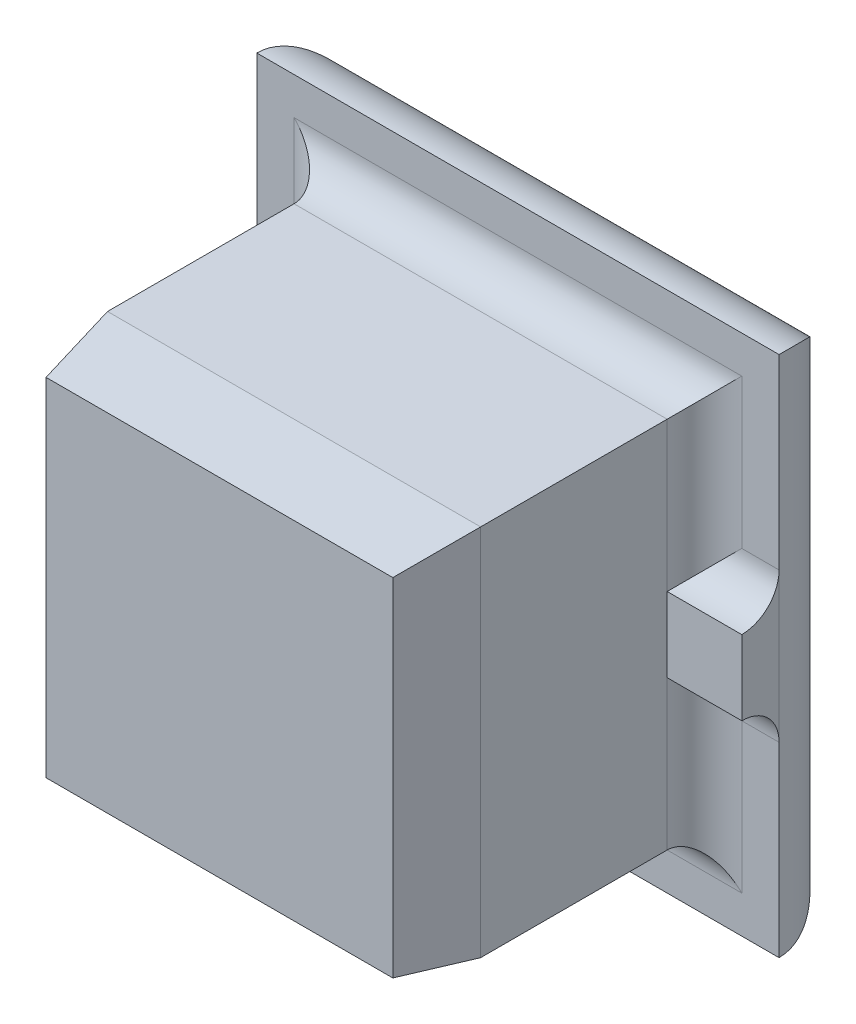
ISO-10303-21;
HEADER;
FILE_DESCRIPTION(('STEP AP214'),'2;1');
FILE_NAME('part.step','',(''),(''),'','','');
FILE_SCHEMA(('AUTOMOTIVE_DESIGN { 1 0 10303 214 1 1 1 1 }'));
ENDSEC;
DATA;
#1=APPLICATION_CONTEXT('core data for automotive mechanical design processes');
#2=APPLICATION_PROTOCOL_DEFINITION('international standard','automotive_design',2000,#1);
#3=PRODUCT_CONTEXT('',#1,'mechanical');
#4=PRODUCT('Part','Part','',(#3));
#5=PRODUCT_RELATED_PRODUCT_CATEGORY('part','',(#4));
#6=PRODUCT_DEFINITION_FORMATION('','',#4);
#7=PRODUCT_DEFINITION_CONTEXT('part definition',#1,'design');
#8=PRODUCT_DEFINITION('design','',#6,#7);
#9=PRODUCT_DEFINITION_SHAPE('','',#8);
#10=(LENGTH_UNIT() NAMED_UNIT(*) SI_UNIT(.MILLI.,.METRE.));
#11=(NAMED_UNIT(*) PLANE_ANGLE_UNIT() SI_UNIT($,.RADIAN.));
#12=(NAMED_UNIT(*) SI_UNIT($,.STERADIAN.) SOLID_ANGLE_UNIT());
#13=UNCERTAINTY_MEASURE_WITH_UNIT(LENGTH_MEASURE(1.E-05),#10,'distance_accuracy_value','');
#14=(GEOMETRIC_REPRESENTATION_CONTEXT(3) GLOBAL_UNCERTAINTY_ASSIGNED_CONTEXT((#13)) GLOBAL_UNIT_ASSIGNED_CONTEXT((#10,
#11,#12)) REPRESENTATION_CONTEXT('',''));
#15=CARTESIAN_POINT('',(0.,0.,0.));
#16=DIRECTION('',(0.,0.,1.));
#17=DIRECTION('',(1.,0.,0.));
#18=AXIS2_PLACEMENT_3D('',#15,#16,#17);
#19=CARTESIAN_POINT('',(0.,0.,0.));
#20=DIRECTION('',(0.,0.,-1.));
#21=DIRECTION('',(-1.,0.,0.));
#22=AXIS2_PLACEMENT_3D('',#19,#20,#21);
#23=PLANE('',#22);
#24=DIRECTION('',(0.,1.,0.));
#25=VECTOR('',#24,1.);
#26=CARTESIAN_POINT('',(6.,1.,0.));
#27=LINE('',#26,#25);
#28=CARTESIAN_POINT('',(6.,6.,0.));
#29=VERTEX_POINT('',#28);
#30=CARTESIAN_POINT('',(6.,2.,0.));
#31=VERTEX_POINT('',#30);
#32=EDGE_CURVE('E84',#29,#31,#27,.F.);
#33=ORIENTED_EDGE('',*,*,#32,.T.);
#34=DIRECTION('',(-1.,0.,0.));
#35=VECTOR('',#34,1.);
#36=CARTESIAN_POINT('',(7.,2.,0.));
#37=LINE('',#36,#35);
#38=CARTESIAN_POINT('',(7.,2.,0.));
#39=VERTEX_POINT('',#38);
#40=EDGE_CURVE('E239',#31,#39,#37,.F.);
#41=ORIENTED_EDGE('',*,*,#40,.T.);
#42=DIRECTION('',(0.,-1.,0.));
#43=VECTOR('',#42,1.);
#44=CARTESIAN_POINT('',(7.,-7.,0.));
#45=LINE('',#44,#43);
#46=CARTESIAN_POINT('',(7.,7.,0.));
#47=VERTEX_POINT('',#46);
#48=EDGE_CURVE('E271',#47,#39,#45,.T.);
#49=ORIENTED_EDGE('',*,*,#48,.F.);
#50=DIRECTION('',(1.,0.,0.));
#51=VECTOR('',#50,1.);
#52=CARTESIAN_POINT('',(-7.,7.,0.));
#53=LINE('',#52,#51);
#54=CARTESIAN_POINT('',(-7.,7.,0.));
#55=VERTEX_POINT('',#54);
#56=EDGE_CURVE('E259',#55,#47,#53,.T.);
#57=ORIENTED_EDGE('',*,*,#56,.F.);
#58=DIRECTION('',(0.,1.,0.));
#59=VECTOR('',#58,1.);
#60=CARTESIAN_POINT('',(-7.,-7.,0.));
#61=LINE('',#60,#59);
#62=CARTESIAN_POINT('',(-7.,2.,0.));
#63=VERTEX_POINT('',#62);
#64=EDGE_CURVE('E260',#63,#55,#61,.T.);
#65=ORIENTED_EDGE('',*,*,#64,.F.);
#66=DIRECTION('',(-1.,0.,0.));
#67=VECTOR('',#66,1.);
#68=CARTESIAN_POINT('',(-5.,2.,0.));
#69=LINE('',#68,#67);
#70=CARTESIAN_POINT('',(-6.,2.,0.));
#71=VERTEX_POINT('',#70);
#72=EDGE_CURVE('E232',#63,#71,#69,.F.);
#73=ORIENTED_EDGE('',*,*,#72,.T.);
#74=DIRECTION('',(0.,-1.,0.));
#75=VECTOR('',#74,1.);
#76=CARTESIAN_POINT('',(-6.,5.,0.));
#77=LINE('',#76,#75);
#78=CARTESIAN_POINT('',(-6.,6.,0.));
#79=VERTEX_POINT('',#78);
#80=EDGE_CURVE('E227',#71,#79,#77,.F.);
#81=ORIENTED_EDGE('',*,*,#80,.T.);
#82=DIRECTION('',(-1.,0.,0.));
#83=VECTOR('',#82,1.);
#84=CARTESIAN_POINT('',(5.,6.,0.));
#85=LINE('',#84,#83);
#86=EDGE_CURVE('E230',#79,#29,#85,.F.);
#87=ORIENTED_EDGE('',*,*,#86,.T.);
#88=EDGE_LOOP('',(#33,#41,#49,#57,#65,#73,#81,#87));
#89=FACE_BOUND('',#88,.T.);
#90=ADVANCED_FACE('F35',(#89),#23,.F.);
#91=CARTESIAN_POINT('',(7.,-2.,0.));
#92=VERTEX_POINT('',#91);
#93=CARTESIAN_POINT('',(7.,-7.,0.));
#94=VERTEX_POINT('',#93);
#95=EDGE_CURVE('E274',#92,#94,#45,.T.);
#96=ORIENTED_EDGE('',*,*,#95,.F.);
#97=DIRECTION('',(1.,0.,0.));
#98=VECTOR('',#97,1.);
#99=CARTESIAN_POINT('',(5.,-2.,0.));
#100=LINE('',#99,#98);
#101=CARTESIAN_POINT('',(6.,-2.,0.));
#102=VERTEX_POINT('',#101);
#103=EDGE_CURVE('E191',#92,#102,#100,.F.);
#104=ORIENTED_EDGE('',*,*,#103,.T.);
#105=DIRECTION('',(0.,1.,0.));
#106=VECTOR('',#105,1.);
#107=CARTESIAN_POINT('',(6.,-5.,0.));
#108=LINE('',#107,#106);
#109=CARTESIAN_POINT('',(6.,-6.,0.));
#110=VERTEX_POINT('',#109);
#111=EDGE_CURVE('E183',#102,#110,#108,.F.);
#112=ORIENTED_EDGE('',*,*,#111,.T.);
#113=DIRECTION('',(1.,0.,0.));
#114=VECTOR('',#113,1.);
#115=CARTESIAN_POINT('',(-5.,-6.,0.));
#116=LINE('',#115,#114);
#117=CARTESIAN_POINT('',(-6.,-6.,0.));
#118=VERTEX_POINT('',#117);
#119=EDGE_CURVE('E241',#110,#118,#116,.F.);
#120=ORIENTED_EDGE('',*,*,#119,.T.);
#121=DIRECTION('',(0.,-1.,0.));
#122=VECTOR('',#121,1.);
#123=CARTESIAN_POINT('',(-6.,-0.999999999999999,0.));
#124=LINE('',#123,#122);
#125=CARTESIAN_POINT('',(-6.,-2.,0.));
#126=VERTEX_POINT('',#125);
#127=EDGE_CURVE('E144',#118,#126,#124,.F.);
#128=ORIENTED_EDGE('',*,*,#127,.T.);
#129=DIRECTION('',(1.,0.,0.));
#130=VECTOR('',#129,1.);
#131=CARTESIAN_POINT('',(-7.,-2.,0.));
#132=LINE('',#131,#130);
#133=CARTESIAN_POINT('',(-7.,-2.,0.));
#134=VERTEX_POINT('',#133);
#135=EDGE_CURVE('E194',#126,#134,#132,.F.);
#136=ORIENTED_EDGE('',*,*,#135,.T.);
#137=CARTESIAN_POINT('',(-7.,-7.,0.));
#138=VERTEX_POINT('',#137);
#139=EDGE_CURVE('E250',#138,#134,#61,.T.);
#140=ORIENTED_EDGE('',*,*,#139,.F.);
#141=DIRECTION('',(-1.,0.,0.));
#142=VECTOR('',#141,1.);
#143=CARTESIAN_POINT('',(-7.,-7.,0.));
#144=LINE('',#143,#142);
#145=EDGE_CURVE('E273',#94,#138,#144,.T.);
#146=ORIENTED_EDGE('',*,*,#145,.F.);
#147=EDGE_LOOP('',(#96,#104,#112,#120,#128,#136,#140,#146));
#148=FACE_BOUND('',#147,.T.);
#149=ADVANCED_FACE('F247',(#148),#23,.F.);
#150=CARTESIAN_POINT('',(5.,-5.,8.));
#151=DIRECTION('',(-1.,0.,0.));
#152=DIRECTION('',(0.,0.,1.));
#153=AXIS2_PLACEMENT_3D('',#150,#151,#152);
#154=PLANE('',#153);
#155=DIRECTION('',(0.,-1.,0.));
#156=VECTOR('',#155,1.);
#157=CARTESIAN_POINT('',(5.,1.,1.));
#158=LINE('',#157,#156);
#159=CARTESIAN_POINT('',(5.,1.,1.));
#160=VERTEX_POINT('',#159);
#161=CARTESIAN_POINT('',(5.,-0.999999999999999,1.));
#162=VERTEX_POINT('',#161);
#163=EDGE_CURVE('E424',#160,#162,#158,.T.);
#164=ORIENTED_EDGE('',*,*,#163,.F.);
#165=DIRECTION('',(0.,1.,0.));
#166=VECTOR('',#165,1.);
#167=CARTESIAN_POINT('',(5.,5.,1.));
#168=LINE('',#167,#166);
#169=CARTESIAN_POINT('',(5.,5.,1.));
#170=VERTEX_POINT('',#169);
#171=EDGE_CURVE('E126',#160,#170,#168,.T.);
#172=ORIENTED_EDGE('',*,*,#171,.T.);
#173=DIRECTION('',(0.,0.,-1.));
#174=VECTOR('',#173,1.);
#175=CARTESIAN_POINT('',(5.,5.,8.));
#176=LINE('',#175,#174);
#177=CARTESIAN_POINT('',(5.,5.,5.99999999999996));
#178=VERTEX_POINT('',#177);
#179=EDGE_CURVE('E279',#178,#170,#176,.T.);
#180=ORIENTED_EDGE('',*,*,#179,.F.);
#181=DIRECTION('',(0.,-1.,0.));
#182=VECTOR('',#181,1.);
#183=CARTESIAN_POINT('',(5.,-5.,5.99999999999996));
#184=LINE('',#183,#182);
#185=CARTESIAN_POINT('',(5.,-5.,5.99999999999996));
#186=VERTEX_POINT('',#185);
#187=EDGE_CURVE('E318',#178,#186,#184,.T.);
#188=ORIENTED_EDGE('',*,*,#187,.T.);
#189=DIRECTION('',(0.,0.,-1.));
#190=VECTOR('',#189,1.);
#191=CARTESIAN_POINT('',(5.,-5.,8.));
#192=LINE('',#191,#190);
#193=CARTESIAN_POINT('',(5.,-5.,1.));
#194=VERTEX_POINT('',#193);
#195=EDGE_CURVE('E138',#186,#194,#192,.T.);
#196=ORIENTED_EDGE('',*,*,#195,.T.);
#197=DIRECTION('',(0.,1.,0.));
#198=VECTOR('',#197,1.);
#199=CARTESIAN_POINT('',(5.,-0.999999999999999,1.));
#200=LINE('',#199,#198);
#201=EDGE_CURVE('E185',#194,#162,#200,.T.);
#202=ORIENTED_EDGE('',*,*,#201,.T.);
#203=EDGE_LOOP('',(#164,#172,#180,#188,#196,#202));
#204=FACE_BOUND('',#203,.T.);
#205=ADVANCED_FACE('F431',(#204),#154,.F.);
#206=CARTESIAN_POINT('',(-5.,-5.,8.));
#207=DIRECTION('',(1.,0.,0.));
#208=DIRECTION('',(0.,0.,-1.));
#209=AXIS2_PLACEMENT_3D('',#206,#207,#208);
#210=PLANE('',#209);
#211=DIRECTION('',(0.,0.,-1.));
#212=VECTOR('',#211,1.);
#213=CARTESIAN_POINT('',(-5.,5.,8.));
#214=LINE('',#213,#212);
#215=CARTESIAN_POINT('',(-5.,5.,5.99999999999996));
#216=VERTEX_POINT('',#215);
#217=CARTESIAN_POINT('',(-5.,5.,1.));
#218=VERTEX_POINT('',#217);
#219=EDGE_CURVE('E200',#216,#218,#214,.T.);
#220=ORIENTED_EDGE('',*,*,#219,.T.);
#221=DIRECTION('',(0.,-1.,0.));
#222=VECTOR('',#221,1.);
#223=CARTESIAN_POINT('',(-5.,1.,1.));
#224=LINE('',#223,#222);
#225=CARTESIAN_POINT('',(-5.,1.,1.));
#226=VERTEX_POINT('',#225);
#227=EDGE_CURVE('E125',#218,#226,#224,.T.);
#228=ORIENTED_EDGE('',*,*,#227,.T.);
#229=DIRECTION('',(0.,1.,0.));
#230=VECTOR('',#229,1.);
#231=CARTESIAN_POINT('',(-5.,1.,1.));
#232=LINE('',#231,#230);
#233=CARTESIAN_POINT('',(-5.,-0.999999999999999,1.));
#234=VERTEX_POINT('',#233);
#235=EDGE_CURVE('E120',#234,#226,#232,.T.);
#236=ORIENTED_EDGE('',*,*,#235,.F.);
#237=DIRECTION('',(0.,-1.,0.));
#238=VECTOR('',#237,1.);
#239=CARTESIAN_POINT('',(-5.,-5.,1.));
#240=LINE('',#239,#238);
#241=CARTESIAN_POINT('',(-5.,-5.,1.));
#242=VERTEX_POINT('',#241);
#243=EDGE_CURVE('E110',#234,#242,#240,.T.);
#244=ORIENTED_EDGE('',*,*,#243,.T.);
#245=DIRECTION('',(0.,0.,-1.));
#246=VECTOR('',#245,1.);
#247=CARTESIAN_POINT('',(-5.,-5.,8.));
#248=LINE('',#247,#246);
#249=CARTESIAN_POINT('',(-5.,-5.,5.99999999999996));
#250=VERTEX_POINT('',#249);
#251=EDGE_CURVE('E116',#250,#242,#248,.T.);
#252=ORIENTED_EDGE('',*,*,#251,.F.);
#253=DIRECTION('',(0.,1.,0.));
#254=VECTOR('',#253,1.);
#255=CARTESIAN_POINT('',(-5.,5.,5.99999999999996));
#256=LINE('',#255,#254);
#257=EDGE_CURVE('E234',#250,#216,#256,.T.);
#258=ORIENTED_EDGE('',*,*,#257,.T.);
#259=EDGE_LOOP('',(#220,#228,#236,#244,#252,#258));
#260=FACE_BOUND('',#259,.T.);
#261=ADVANCED_FACE('F113',(#260),#210,.F.);
#262=CARTESIAN_POINT('',(5.,-5.,8.));
#263=DIRECTION('',(0.,1.,0.));
#264=DIRECTION('',(0.,0.,1.));
#265=AXIS2_PLACEMENT_3D('',#262,#263,#264);
#266=PLANE('',#265);
#267=ORIENTED_EDGE('',*,*,#251,.T.);
#268=DIRECTION('',(1.,0.,0.));
#269=VECTOR('',#268,1.);
#270=CARTESIAN_POINT('',(5.,-5.,1.));
#271=LINE('',#270,#269);
#272=EDGE_CURVE('E133',#242,#194,#271,.T.);
#273=ORIENTED_EDGE('',*,*,#272,.T.);
#274=ORIENTED_EDGE('',*,*,#195,.F.);
#275=DIRECTION('',(-1.,0.,0.));
#276=VECTOR('',#275,1.);
#277=CARTESIAN_POINT('',(-5.,-5.,5.99999999999996));
#278=LINE('',#277,#276);
#279=EDGE_CURVE('E136',#186,#250,#278,.T.);
#280=ORIENTED_EDGE('',*,*,#279,.T.);
#281=EDGE_LOOP('',(#267,#273,#274,#280));
#282=FACE_BOUND('',#281,.T.);
#283=ADVANCED_FACE('F130',(#282),#266,.F.);
#284=CARTESIAN_POINT('',(5.,5.,8.));
#285=DIRECTION('',(0.,-1.,0.));
#286=DIRECTION('',(1.,0.,0.));
#287=AXIS2_PLACEMENT_3D('',#284,#285,#286);
#288=PLANE('',#287);
#289=ORIENTED_EDGE('',*,*,#179,.T.);
#290=DIRECTION('',(-1.,0.,0.));
#291=VECTOR('',#290,1.);
#292=CARTESIAN_POINT('',(-5.,5.,1.));
#293=LINE('',#292,#291);
#294=EDGE_CURVE('E153',#170,#218,#293,.T.);
#295=ORIENTED_EDGE('',*,*,#294,.T.);
#296=ORIENTED_EDGE('',*,*,#219,.F.);
#297=DIRECTION('',(1.,0.,0.));
#298=VECTOR('',#297,1.);
#299=CARTESIAN_POINT('',(5.,5.,5.99999999999996));
#300=LINE('',#299,#298);
#301=EDGE_CURVE('E321',#216,#178,#300,.T.);
#302=ORIENTED_EDGE('',*,*,#301,.T.);
#303=EDGE_LOOP('',(#289,#295,#296,#302));
#304=FACE_BOUND('',#303,.T.);
#305=ADVANCED_FACE('F434',(#304),#288,.F.);
#306=CARTESIAN_POINT('',(0.,0.,8.));
#307=DIRECTION('',(0.,0.,1.));
#308=DIRECTION('',(1.,0.,0.));
#309=AXIS2_PLACEMENT_3D('',#306,#307,#308);
#310=PLANE('',#309);
#311=DIRECTION('',(0.,-1.,0.));
#312=VECTOR('',#311,1.);
#313=CARTESIAN_POINT('',(-4.64734603858307,-5.,8.));
#314=LINE('',#313,#312);
#315=CARTESIAN_POINT('',(-4.64734603858307,4.64734603858307,8.));
#316=VERTEX_POINT('',#315);
#317=CARTESIAN_POINT('',(-4.64734603858307,-4.64734603858307,8.));
#318=VERTEX_POINT('',#317);
#319=EDGE_CURVE('E294',#316,#318,#314,.T.);
#320=ORIENTED_EDGE('',*,*,#319,.T.);
#321=DIRECTION('',(1.,0.,0.));
#322=VECTOR('',#321,1.);
#323=CARTESIAN_POINT('',(5.,-4.64734603858307,8.));
#324=LINE('',#323,#322);
#325=CARTESIAN_POINT('',(4.64734603858307,-4.64734603858307,8.));
#326=VERTEX_POINT('',#325);
#327=EDGE_CURVE('E314',#318,#326,#324,.T.);
#328=ORIENTED_EDGE('',*,*,#327,.T.);
#329=DIRECTION('',(0.,1.,0.));
#330=VECTOR('',#329,1.);
#331=CARTESIAN_POINT('',(4.64734603858307,5.,8.));
#332=LINE('',#331,#330);
#333=CARTESIAN_POINT('',(4.64734603858307,4.64734603858307,8.));
#334=VERTEX_POINT('',#333);
#335=EDGE_CURVE('E311',#326,#334,#332,.T.);
#336=ORIENTED_EDGE('',*,*,#335,.T.);
#337=DIRECTION('',(-1.,0.,0.));
#338=VECTOR('',#337,1.);
#339=CARTESIAN_POINT('',(-5.,4.64734603858307,8.));
#340=LINE('',#339,#338);
#341=EDGE_CURVE('E308',#334,#316,#340,.T.);
#342=ORIENTED_EDGE('',*,*,#341,.T.);
#343=EDGE_LOOP('',(#320,#328,#336,#342));
#344=FACE_BOUND('',#343,.T.);
#345=ADVANCED_FACE('F436',(#344),#310,.T.);
#346=CARTESIAN_POINT('',(0.,0.,-2.));
#347=DIRECTION('',(0.,0.,-1.));
#348=DIRECTION('',(-1.,0.,0.));
#349=AXIS2_PLACEMENT_3D('',#346,#347,#348);
#350=PLANE('',#349);
#351=DIRECTION('',(0.,1.,0.));
#352=VECTOR('',#351,1.);
#353=CARTESIAN_POINT('',(-5.,7.,-2.));
#354=LINE('',#353,#352);
#355=CARTESIAN_POINT('',(-5.,-5.,-2.));
#356=VERTEX_POINT('',#355);
#357=CARTESIAN_POINT('',(-5.,5.,-2.));
#358=VERTEX_POINT('',#357);
#359=EDGE_CURVE('E288',#356,#358,#354,.T.);
#360=ORIENTED_EDGE('',*,*,#359,.T.);
#361=DIRECTION('',(1.,0.,0.));
#362=VECTOR('',#361,1.);
#363=CARTESIAN_POINT('',(7.,5.,-2.));
#364=LINE('',#363,#362);
#365=CARTESIAN_POINT('',(5.,5.,-2.));
#366=VERTEX_POINT('',#365);
#367=EDGE_CURVE('E291',#358,#366,#364,.T.);
#368=ORIENTED_EDGE('',*,*,#367,.T.);
#369=DIRECTION('',(0.,-1.,0.));
#370=VECTOR('',#369,1.);
#371=CARTESIAN_POINT('',(5.,-7.,-2.));
#372=LINE('',#371,#370);
#373=CARTESIAN_POINT('',(5.,-5.,-2.));
#374=VERTEX_POINT('',#373);
#375=EDGE_CURVE('E137',#366,#374,#372,.T.);
#376=ORIENTED_EDGE('',*,*,#375,.T.);
#377=DIRECTION('',(-1.,0.,0.));
#378=VECTOR('',#377,1.);
#379=CARTESIAN_POINT('',(-7.,-5.,-2.));
#380=LINE('',#379,#378);
#381=EDGE_CURVE('E285',#374,#356,#380,.T.);
#382=ORIENTED_EDGE('',*,*,#381,.T.);
#383=EDGE_LOOP('',(#360,#368,#376,#382));
#384=FACE_BOUND('',#383,.T.);
#385=ADVANCED_FACE('F402',(#384),#350,.T.);
#386=CARTESIAN_POINT('',(0.,-5.,0.));
#387=DIRECTION('',(1.,0.,0.));
#388=DIRECTION('',(0.,0.,-1.));
#389=AXIS2_PLACEMENT_3D('',#386,#387,#388);
#390=CYLINDRICAL_SURFACE('',#389,2.);
#391=CARTESIAN_POINT('',(5.,-5.,0.));
#392=DIRECTION('',(0.707106781186547,0.707106781186547,0.));
#393=DIRECTION('',(-0.707106781186547,0.707106781186547,0.));
#394=AXIS2_PLACEMENT_3D('',#391,#392,#393);
#395=ELLIPSE('',#394,2.82842712474619,2.);
#396=EDGE_CURVE('E302',#94,#374,#395,.T.);
#397=ORIENTED_EDGE('',*,*,#396,.F.);
#398=ORIENTED_EDGE('',*,*,#145,.T.);
#399=CARTESIAN_POINT('',(-5.,-5.,0.));
#400=DIRECTION('',(0.707106781186547,-0.707106781186547,0.));
#401=DIRECTION('',(0.707106781186547,0.707106781186547,0.));
#402=AXIS2_PLACEMENT_3D('',#399,#400,#401);
#403=ELLIPSE('',#402,2.82842712474619,2.);
#404=EDGE_CURVE('E258',#356,#138,#403,.F.);
#405=ORIENTED_EDGE('',*,*,#404,.F.);
#406=ORIENTED_EDGE('',*,*,#381,.F.);
#407=EDGE_LOOP('',(#397,#398,#405,#406));
#408=FACE_BOUND('',#407,.T.);
#409=ADVANCED_FACE('F407',(#408),#390,.T.);
#410=CARTESIAN_POINT('',(-5.,0.,0.));
#411=DIRECTION('',(0.,-1.,0.));
#412=DIRECTION('',(0.,0.,-1.));
#413=AXIS2_PLACEMENT_3D('',#410,#411,#412);
#414=CYLINDRICAL_SURFACE('',#413,2.);
#415=ORIENTED_EDGE('',*,*,#404,.T.);
#416=ORIENTED_EDGE('',*,*,#139,.T.);
#417=DIRECTION('',(0.,-1.,0.));
#418=VECTOR('',#417,1.);
#419=CARTESIAN_POINT('',(-7.,1.,0.));
#420=LINE('',#419,#418);
#421=EDGE_CURVE('E52',#63,#134,#420,.T.);
#422=ORIENTED_EDGE('',*,*,#421,.F.);
#423=ORIENTED_EDGE('',*,*,#64,.T.);
#424=CARTESIAN_POINT('',(-5.,5.,0.));
#425=DIRECTION('',(-0.707106781186547,-0.707106781186547,0.));
#426=DIRECTION('',(0.707106781186547,-0.707106781186547,0.));
#427=AXIS2_PLACEMENT_3D('',#424,#425,#426);
#428=ELLIPSE('',#427,2.82842712474619,2.);
#429=EDGE_CURVE('E298',#358,#55,#428,.F.);
#430=ORIENTED_EDGE('',*,*,#429,.F.);
#431=ORIENTED_EDGE('',*,*,#359,.F.);
#432=EDGE_LOOP('',(#415,#416,#422,#423,#430,#431));
#433=FACE_BOUND('',#432,.T.);
#434=ADVANCED_FACE('F255',(#433),#414,.T.);
#435=CARTESIAN_POINT('',(5.,0.,0.));
#436=DIRECTION('',(0.,1.,0.));
#437=DIRECTION('',(0.,0.,1.));
#438=AXIS2_PLACEMENT_3D('',#435,#436,#437);
#439=CYLINDRICAL_SURFACE('',#438,2.);
#440=ORIENTED_EDGE('',*,*,#396,.T.);
#441=ORIENTED_EDGE('',*,*,#375,.F.);
#442=CARTESIAN_POINT('',(5.,5.,0.));
#443=DIRECTION('',(-0.707106781186547,0.707106781186547,0.));
#444=DIRECTION('',(0.707106781186547,0.707106781186547,0.));
#445=AXIS2_PLACEMENT_3D('',#442,#443,#444);
#446=ELLIPSE('',#445,2.82842712474619,2.);
#447=EDGE_CURVE('E295',#47,#366,#446,.T.);
#448=ORIENTED_EDGE('',*,*,#447,.F.);
#449=ORIENTED_EDGE('',*,*,#48,.T.);
#450=DIRECTION('',(0.,1.,0.));
#451=VECTOR('',#450,1.);
#452=CARTESIAN_POINT('',(7.,1.,0.));
#453=LINE('',#452,#451);
#454=EDGE_CURVE('E61',#92,#39,#453,.T.);
#455=ORIENTED_EDGE('',*,*,#454,.F.);
#456=ORIENTED_EDGE('',*,*,#95,.T.);
#457=EDGE_LOOP('',(#440,#441,#448,#449,#455,#456));
#458=FACE_BOUND('',#457,.T.);
#459=ADVANCED_FACE('F413',(#458),#439,.T.);
#460=CARTESIAN_POINT('',(0.,5.,0.));
#461=DIRECTION('',(-1.,0.,0.));
#462=DIRECTION('',(0.,0.,1.));
#463=AXIS2_PLACEMENT_3D('',#460,#461,#462);
#464=CYLINDRICAL_SURFACE('',#463,2.);
#465=ORIENTED_EDGE('',*,*,#429,.T.);
#466=ORIENTED_EDGE('',*,*,#56,.T.);
#467=ORIENTED_EDGE('',*,*,#447,.T.);
#468=ORIENTED_EDGE('',*,*,#367,.F.);
#469=EDGE_LOOP('',(#465,#466,#467,#468));
#470=FACE_BOUND('',#469,.T.);
#471=ADVANCED_FACE('F411',(#470),#464,.T.);
#472=CARTESIAN_POINT('',(0.,4.64734603858307,8.));
#473=DIRECTION('',(0.,0.984807753012209,0.173648177666928));
#474=DIRECTION('',(1.,0.,0.));
#475=AXIS2_PLACEMENT_3D('',#472,#473,#474);
#476=PLANE('',#475);
#477=DIRECTION('',(0.171087869746033,0.171087869746033,-0.970287525247815));
#478=VECTOR('',#477,1.);
#479=CARTESIAN_POINT('',(4.51131329768455,4.51131329768455,8.77148001033052));
#480=LINE('',#479,#478);
#481=EDGE_CURVE('E330',#178,#334,#480,.F.);
#482=ORIENTED_EDGE('',*,*,#481,.F.);
#483=ORIENTED_EDGE('',*,*,#301,.F.);
#484=DIRECTION('',(-0.171087869746033,0.171087869746033,-0.970287525247815));
#485=VECTOR('',#484,1.);
#486=CARTESIAN_POINT('',(-4.51131329768455,4.51131329768455,8.77148001033052));
#487=LINE('',#486,#485);
#488=EDGE_CURVE('E299',#316,#216,#487,.T.);
#489=ORIENTED_EDGE('',*,*,#488,.F.);
#490=ORIENTED_EDGE('',*,*,#341,.F.);
#491=EDGE_LOOP('',(#482,#483,#489,#490));
#492=FACE_BOUND('',#491,.T.);
#493=ADVANCED_FACE('F347',(#492),#476,.T.);
#494=CARTESIAN_POINT('',(-4.64734603858307,0.,8.));
#495=DIRECTION('',(-0.984807753012209,0.,0.173648177666928));
#496=DIRECTION('',(0.,1.,0.));
#497=AXIS2_PLACEMENT_3D('',#494,#495,#496);
#498=PLANE('',#497);
#499=ORIENTED_EDGE('',*,*,#488,.T.);
#500=ORIENTED_EDGE('',*,*,#257,.F.);
#501=DIRECTION('',(0.171087869746033,0.171087869746033,0.970287525247815));
#502=VECTOR('',#501,1.);
#503=CARTESIAN_POINT('',(-4.51131329768455,-4.51131329768455,8.77148001033052));
#504=LINE('',#503,#502);
#505=EDGE_CURVE('E327',#318,#250,#504,.F.);
#506=ORIENTED_EDGE('',*,*,#505,.F.);
#507=ORIENTED_EDGE('',*,*,#319,.F.);
#508=EDGE_LOOP('',(#499,#500,#506,#507));
#509=FACE_BOUND('',#508,.T.);
#510=ADVANCED_FACE('F338',(#509),#498,.T.);
#511=CARTESIAN_POINT('',(4.64734603858307,0.,8.));
#512=DIRECTION('',(0.984807753012209,0.,0.173648177666928));
#513=DIRECTION('',(0.,-1.,0.));
#514=AXIS2_PLACEMENT_3D('',#511,#512,#513);
#515=PLANE('',#514);
#516=ORIENTED_EDGE('',*,*,#481,.T.);
#517=ORIENTED_EDGE('',*,*,#335,.F.);
#518=DIRECTION('',(0.171087869746033,-0.171087869746033,-0.970287525247815));
#519=VECTOR('',#518,1.);
#520=CARTESIAN_POINT('',(4.51131329768455,-4.51131329768455,8.77148001033052));
#521=LINE('',#520,#519);
#522=EDGE_CURVE('E266',#186,#326,#521,.F.);
#523=ORIENTED_EDGE('',*,*,#522,.F.);
#524=ORIENTED_EDGE('',*,*,#187,.F.);
#525=EDGE_LOOP('',(#516,#517,#523,#524));
#526=FACE_BOUND('',#525,.T.);
#527=ADVANCED_FACE('F593',(#526),#515,.T.);
#528=CARTESIAN_POINT('',(0.,-4.64734603858307,8.));
#529=DIRECTION('',(0.,-0.984807753012209,0.173648177666928));
#530=DIRECTION('',(-1.,0.,0.));
#531=AXIS2_PLACEMENT_3D('',#528,#529,#530);
#532=PLANE('',#531);
#533=ORIENTED_EDGE('',*,*,#505,.T.);
#534=ORIENTED_EDGE('',*,*,#279,.F.);
#535=ORIENTED_EDGE('',*,*,#522,.T.);
#536=ORIENTED_EDGE('',*,*,#327,.F.);
#537=EDGE_LOOP('',(#533,#534,#535,#536));
#538=FACE_BOUND('',#537,.T.);
#539=ADVANCED_FACE('F455',(#538),#532,.T.);
#540=CARTESIAN_POINT('',(-7.,1.,1.));
#541=DIRECTION('',(1.,0.,0.));
#542=DIRECTION('',(0.,0.,-1.));
#543=AXIS2_PLACEMENT_3D('',#540,#541,#542);
#544=PLANE('',#543);
#545=ORIENTED_EDGE('',*,*,#421,.T.);
#546=CARTESIAN_POINT('',(-7.,-2.,1.));
#547=DIRECTION('',(1.,0.,0.));
#548=DIRECTION('',(0.,0.,-1.));
#549=AXIS2_PLACEMENT_3D('',#546,#547,#548);
#550=CIRCLE('',#549,1.);
#551=CARTESIAN_POINT('',(-7.,-0.999999999999999,1.));
#552=VERTEX_POINT('',#551);
#553=EDGE_CURVE('E44',#134,#552,#550,.T.);
#554=ORIENTED_EDGE('',*,*,#553,.T.);
#555=DIRECTION('',(0.,-1.,0.));
#556=VECTOR('',#555,1.);
#557=CARTESIAN_POINT('',(-7.,1.,1.));
#558=LINE('',#557,#556);
#559=CARTESIAN_POINT('',(-7.,1.,1.));
#560=VERTEX_POINT('',#559);
#561=EDGE_CURVE('E223',#560,#552,#558,.T.);
#562=ORIENTED_EDGE('',*,*,#561,.F.);
#563=CARTESIAN_POINT('',(-7.,2.,1.));
#564=DIRECTION('',(1.,0.,0.));
#565=DIRECTION('',(0.,0.,-1.));
#566=AXIS2_PLACEMENT_3D('',#563,#564,#565);
#567=CIRCLE('',#566,1.);
#568=EDGE_CURVE('E11',#560,#63,#567,.T.);
#569=ORIENTED_EDGE('',*,*,#568,.T.);
#570=EDGE_LOOP('',(#545,#554,#562,#569));
#571=FACE_BOUND('',#570,.T.);
#572=ADVANCED_FACE('F263',(#571),#544,.F.);
#573=CARTESIAN_POINT('',(0.,0.,1.));
#574=DIRECTION('',(0.,0.,1.));
#575=DIRECTION('',(1.,0.,0.));
#576=AXIS2_PLACEMENT_3D('',#573,#574,#575);
#577=PLANE('',#576);
#578=ORIENTED_EDGE('',*,*,#235,.T.);
#579=DIRECTION('',(-1.,0.,0.));
#580=VECTOR('',#579,1.);
#581=CARTESIAN_POINT('',(-7.,1.,1.));
#582=LINE('',#581,#580);
#583=EDGE_CURVE('E212',#226,#560,#582,.T.);
#584=ORIENTED_EDGE('',*,*,#583,.T.);
#585=ORIENTED_EDGE('',*,*,#561,.T.);
#586=DIRECTION('',(1.,0.,0.));
#587=VECTOR('',#586,1.);
#588=CARTESIAN_POINT('',(-7.,-0.999999999999999,1.));
#589=LINE('',#588,#587);
#590=EDGE_CURVE('E215',#552,#234,#589,.T.);
#591=ORIENTED_EDGE('',*,*,#590,.T.);
#592=EDGE_LOOP('',(#578,#584,#585,#591));
#593=FACE_BOUND('',#592,.T.);
#594=ADVANCED_FACE('F210',(#593),#577,.T.);
#595=CARTESIAN_POINT('',(7.,1.,1.));
#596=DIRECTION('',(-1.,0.,0.));
#597=DIRECTION('',(0.,0.,1.));
#598=AXIS2_PLACEMENT_3D('',#595,#596,#597);
#599=PLANE('',#598);
#600=ORIENTED_EDGE('',*,*,#454,.T.);
#601=CARTESIAN_POINT('',(7.,2.,1.));
#602=DIRECTION('',(-1.,0.,0.));
#603=DIRECTION('',(0.,0.,1.));
#604=AXIS2_PLACEMENT_3D('',#601,#602,#603);
#605=CIRCLE('',#604,1.);
#606=CARTESIAN_POINT('',(7.,1.,1.));
#607=VERTEX_POINT('',#606);
#608=EDGE_CURVE('E152',#39,#607,#605,.T.);
#609=ORIENTED_EDGE('',*,*,#608,.T.);
#610=DIRECTION('',(0.,1.,0.));
#611=VECTOR('',#610,1.);
#612=CARTESIAN_POINT('',(7.,1.,1.));
#613=LINE('',#612,#611);
#614=CARTESIAN_POINT('',(7.,-0.999999999999999,1.));
#615=VERTEX_POINT('',#614);
#616=EDGE_CURVE('E419',#615,#607,#613,.T.);
#617=ORIENTED_EDGE('',*,*,#616,.F.);
#618=CARTESIAN_POINT('',(7.,-2.,1.));
#619=DIRECTION('',(-1.,0.,0.));
#620=DIRECTION('',(0.,0.,1.));
#621=AXIS2_PLACEMENT_3D('',#618,#619,#620);
#622=CIRCLE('',#621,1.);
#623=EDGE_CURVE('E156',#615,#92,#622,.T.);
#624=ORIENTED_EDGE('',*,*,#623,.T.);
#625=EDGE_LOOP('',(#600,#609,#617,#624));
#626=FACE_BOUND('',#625,.T.);
#627=ADVANCED_FACE('F417',(#626),#599,.F.);
#628=CARTESIAN_POINT('',(0.,0.,1.));
#629=DIRECTION('',(0.,0.,1.));
#630=DIRECTION('',(1.,0.,0.));
#631=AXIS2_PLACEMENT_3D('',#628,#629,#630);
#632=PLANE('',#631);
#633=ORIENTED_EDGE('',*,*,#616,.T.);
#634=DIRECTION('',(-1.,0.,0.));
#635=VECTOR('',#634,1.);
#636=CARTESIAN_POINT('',(5.,1.,1.));
#637=LINE('',#636,#635);
#638=EDGE_CURVE('E380',#607,#160,#637,.T.);
#639=ORIENTED_EDGE('',*,*,#638,.T.);
#640=ORIENTED_EDGE('',*,*,#163,.T.);
#641=DIRECTION('',(1.,0.,0.));
#642=VECTOR('',#641,1.);
#643=CARTESIAN_POINT('',(5.,-0.999999999999999,1.));
#644=LINE('',#643,#642);
#645=EDGE_CURVE('E270',#162,#615,#644,.T.);
#646=ORIENTED_EDGE('',*,*,#645,.T.);
#647=EDGE_LOOP('',(#633,#639,#640,#646));
#648=FACE_BOUND('',#647,.T.);
#649=ADVANCED_FACE('F430',(#648),#632,.T.);
#650=CARTESIAN_POINT('',(-7.,2.,1.));
#651=DIRECTION('',(1.,0.,0.));
#652=DIRECTION('',(0.,0.,-1.));
#653=AXIS2_PLACEMENT_3D('',#650,#651,#652);
#654=CYLINDRICAL_SURFACE('',#653,1.);
#655=ORIENTED_EDGE('',*,*,#568,.F.);
#656=ORIENTED_EDGE('',*,*,#583,.F.);
#657=CARTESIAN_POINT('',(-6.,2.,1.));
#658=DIRECTION('',(0.707106781186547,0.707106781186547,0.));
#659=DIRECTION('',(0.707106781186547,-0.707106781186547,0.));
#660=AXIS2_PLACEMENT_3D('',#657,#658,#659);
#661=ELLIPSE('',#660,1.41421356237309,1.);
#662=EDGE_CURVE('E173',#71,#226,#661,.F.);
#663=ORIENTED_EDGE('',*,*,#662,.F.);
#664=ORIENTED_EDGE('',*,*,#72,.F.);
#665=EDGE_LOOP('',(#655,#656,#663,#664));
#666=FACE_BOUND('',#665,.T.);
#667=ADVANCED_FACE('F220',(#666),#654,.F.);
#668=CARTESIAN_POINT('',(-6.,-5.,1.));
#669=DIRECTION('',(0.,1.,0.));
#670=DIRECTION('',(0.,0.,1.));
#671=AXIS2_PLACEMENT_3D('',#668,#669,#670);
#672=CYLINDRICAL_SURFACE('',#671,1.);
#673=ORIENTED_EDGE('',*,*,#662,.T.);
#674=ORIENTED_EDGE('',*,*,#227,.F.);
#675=CARTESIAN_POINT('',(-6.,6.,1.));
#676=DIRECTION('',(0.707106781186547,0.707106781186548,0.));
#677=DIRECTION('',(0.707106781186548,-0.707106781186547,0.));
#678=AXIS2_PLACEMENT_3D('',#675,#676,#677);
#679=ELLIPSE('',#678,1.41421356237309,1.);
#680=EDGE_CURVE('E170',#79,#218,#679,.F.);
#681=ORIENTED_EDGE('',*,*,#680,.F.);
#682=ORIENTED_EDGE('',*,*,#80,.F.);
#683=EDGE_LOOP('',(#673,#674,#681,#682));
#684=FACE_BOUND('',#683,.T.);
#685=ADVANCED_FACE('F225',(#684),#672,.F.);
#686=CARTESIAN_POINT('',(5.,6.,1.));
#687=DIRECTION('',(1.,0.,0.));
#688=DIRECTION('',(0.,1.,0.));
#689=AXIS2_PLACEMENT_3D('',#686,#687,#688);
#690=CYLINDRICAL_SURFACE('',#689,1.);
#691=ORIENTED_EDGE('',*,*,#680,.T.);
#692=ORIENTED_EDGE('',*,*,#294,.F.);
#693=CARTESIAN_POINT('',(6.,6.,1.));
#694=DIRECTION('',(0.707106781186548,-0.707106781186547,0.));
#695=DIRECTION('',(0.707106781186547,0.707106781186548,0.));
#696=AXIS2_PLACEMENT_3D('',#693,#694,#695);
#697=ELLIPSE('',#696,1.4142135623731,1.);
#698=EDGE_CURVE('E167',#29,#170,#697,.F.);
#699=ORIENTED_EDGE('',*,*,#698,.F.);
#700=ORIENTED_EDGE('',*,*,#86,.F.);
#701=EDGE_LOOP('',(#691,#692,#699,#700));
#702=FACE_BOUND('',#701,.T.);
#703=ADVANCED_FACE('F368',(#702),#690,.F.);
#704=CARTESIAN_POINT('',(6.,-5.,1.));
#705=DIRECTION('',(0.,-1.,0.));
#706=DIRECTION('',(0.,0.,-1.));
#707=AXIS2_PLACEMENT_3D('',#704,#705,#706);
#708=CYLINDRICAL_SURFACE('',#707,1.);
#709=ORIENTED_EDGE('',*,*,#698,.T.);
#710=ORIENTED_EDGE('',*,*,#171,.F.);
#711=CARTESIAN_POINT('',(6.,2.,1.));
#712=DIRECTION('',(0.707106781186547,-0.707106781186547,0.));
#713=DIRECTION('',(0.707106781186547,0.707106781186547,0.));
#714=AXIS2_PLACEMENT_3D('',#711,#712,#713);
#715=ELLIPSE('',#714,1.41421356237309,1.);
#716=EDGE_CURVE('E164',#31,#160,#715,.F.);
#717=ORIENTED_EDGE('',*,*,#716,.F.);
#718=ORIENTED_EDGE('',*,*,#32,.F.);
#719=EDGE_LOOP('',(#709,#710,#717,#718));
#720=FACE_BOUND('',#719,.T.);
#721=ADVANCED_FACE('F372',(#720),#708,.F.);
#722=CARTESIAN_POINT('',(5.,2.,1.));
#723=DIRECTION('',(1.,0.,0.));
#724=DIRECTION('',(0.,0.,-1.));
#725=AXIS2_PLACEMENT_3D('',#722,#723,#724);
#726=CYLINDRICAL_SURFACE('',#725,1.);
#727=ORIENTED_EDGE('',*,*,#608,.F.);
#728=ORIENTED_EDGE('',*,*,#40,.F.);
#729=ORIENTED_EDGE('',*,*,#716,.T.);
#730=ORIENTED_EDGE('',*,*,#638,.F.);
#731=EDGE_LOOP('',(#727,#728,#729,#730));
#732=FACE_BOUND('',#731,.T.);
#733=ADVANCED_FACE('F378',(#732),#726,.F.);
#734=CARTESIAN_POINT('',(-7.,-2.,1.));
#735=DIRECTION('',(-1.,0.,0.));
#736=DIRECTION('',(0.,-1.,0.));
#737=AXIS2_PLACEMENT_3D('',#734,#735,#736);
#738=CYLINDRICAL_SURFACE('',#737,1.);
#739=ORIENTED_EDGE('',*,*,#553,.F.);
#740=ORIENTED_EDGE('',*,*,#135,.F.);
#741=CARTESIAN_POINT('',(-6.,-2.,1.));
#742=DIRECTION('',(-0.707106781186548,0.707106781186547,0.));
#743=DIRECTION('',(-0.707106781186547,-0.707106781186547,0.));
#744=AXIS2_PLACEMENT_3D('',#741,#742,#743);
#745=ELLIPSE('',#744,1.4142135623731,1.);
#746=EDGE_CURVE('E39',#234,#126,#745,.T.);
#747=ORIENTED_EDGE('',*,*,#746,.F.);
#748=ORIENTED_EDGE('',*,*,#590,.F.);
#749=EDGE_LOOP('',(#739,#740,#747,#748));
#750=FACE_BOUND('',#749,.T.);
#751=ADVANCED_FACE('F37',(#750),#738,.F.);
#752=CARTESIAN_POINT('',(-6.,-5.,1.));
#753=DIRECTION('',(0.,1.,0.));
#754=DIRECTION('',(0.,0.,1.));
#755=AXIS2_PLACEMENT_3D('',#752,#753,#754);
#756=CYLINDRICAL_SURFACE('',#755,1.);
#757=ORIENTED_EDGE('',*,*,#746,.T.);
#758=ORIENTED_EDGE('',*,*,#127,.F.);
#759=CARTESIAN_POINT('',(-6.,-6.,1.));
#760=DIRECTION('',(-0.707106781186547,0.707106781186547,0.));
#761=DIRECTION('',(-0.707106781186547,-0.707106781186547,0.));
#762=AXIS2_PLACEMENT_3D('',#759,#760,#761);
#763=ELLIPSE('',#762,1.41421356237309,1.);
#764=EDGE_CURVE('E142',#242,#118,#763,.T.);
#765=ORIENTED_EDGE('',*,*,#764,.F.);
#766=ORIENTED_EDGE('',*,*,#243,.F.);
#767=EDGE_LOOP('',(#757,#758,#765,#766));
#768=FACE_BOUND('',#767,.T.);
#769=ADVANCED_FACE('F143',(#768),#756,.F.);
#770=CARTESIAN_POINT('',(5.,-6.,1.));
#771=DIRECTION('',(-1.,0.,0.));
#772=DIRECTION('',(0.,0.,1.));
#773=AXIS2_PLACEMENT_3D('',#770,#771,#772);
#774=CYLINDRICAL_SURFACE('',#773,1.);
#775=ORIENTED_EDGE('',*,*,#764,.T.);
#776=ORIENTED_EDGE('',*,*,#119,.F.);
#777=CARTESIAN_POINT('',(6.,-6.,1.));
#778=DIRECTION('',(-0.707106781186547,-0.707106781186547,0.));
#779=DIRECTION('',(-0.707106781186547,0.707106781186547,0.));
#780=AXIS2_PLACEMENT_3D('',#777,#778,#779);
#781=ELLIPSE('',#780,1.41421356237309,1.);
#782=EDGE_CURVE('E147',#194,#110,#781,.T.);
#783=ORIENTED_EDGE('',*,*,#782,.F.);
#784=ORIENTED_EDGE('',*,*,#272,.F.);
#785=EDGE_LOOP('',(#775,#776,#783,#784));
#786=FACE_BOUND('',#785,.T.);
#787=ADVANCED_FACE('F149',(#786),#774,.F.);
#788=CARTESIAN_POINT('',(6.,-5.,1.));
#789=DIRECTION('',(0.,-1.,0.));
#790=DIRECTION('',(0.,0.,-1.));
#791=AXIS2_PLACEMENT_3D('',#788,#789,#790);
#792=CYLINDRICAL_SURFACE('',#791,1.);
#793=ORIENTED_EDGE('',*,*,#782,.T.);
#794=ORIENTED_EDGE('',*,*,#111,.F.);
#795=CARTESIAN_POINT('',(6.,-2.,1.));
#796=DIRECTION('',(-0.707106781186547,-0.707106781186547,0.));
#797=DIRECTION('',(-0.707106781186547,0.707106781186547,0.));
#798=AXIS2_PLACEMENT_3D('',#795,#796,#797);
#799=ELLIPSE('',#798,1.41421356237309,1.);
#800=EDGE_CURVE('E176',#162,#102,#799,.T.);
#801=ORIENTED_EDGE('',*,*,#800,.F.);
#802=ORIENTED_EDGE('',*,*,#201,.F.);
#803=EDGE_LOOP('',(#793,#794,#801,#802));
#804=FACE_BOUND('',#803,.T.);
#805=ADVANCED_FACE('F181',(#804),#792,.F.);
#806=CARTESIAN_POINT('',(5.,-2.,1.));
#807=DIRECTION('',(-1.,0.,0.));
#808=DIRECTION('',(0.,0.,1.));
#809=AXIS2_PLACEMENT_3D('',#806,#807,#808);
#810=CYLINDRICAL_SURFACE('',#809,1.);
#811=ORIENTED_EDGE('',*,*,#800,.T.);
#812=ORIENTED_EDGE('',*,*,#103,.F.);
#813=ORIENTED_EDGE('',*,*,#623,.F.);
#814=ORIENTED_EDGE('',*,*,#645,.F.);
#815=EDGE_LOOP('',(#811,#812,#813,#814));
#816=FACE_BOUND('',#815,.T.);
#817=ADVANCED_FACE('F422',(#816),#810,.F.);
#818=CLOSED_SHELL('',(#90,#149,#205,#261,#283,#305,#345,#385,#409,#434,#459,#471,#493,#510,#527,
#539,#572,#594,#627,#649,#667,#685,#703,#721,#733,#751,#769,#787,#805,#817));
#819=MANIFOLD_SOLID_BREP('B2',#818);
#820=ADVANCED_BREP_SHAPE_REPRESENTATION('',(#18,#819),#14);
#821=SHAPE_DEFINITION_REPRESENTATION(#9,#820);
ENDSEC;
END-ISO-10303-21;
